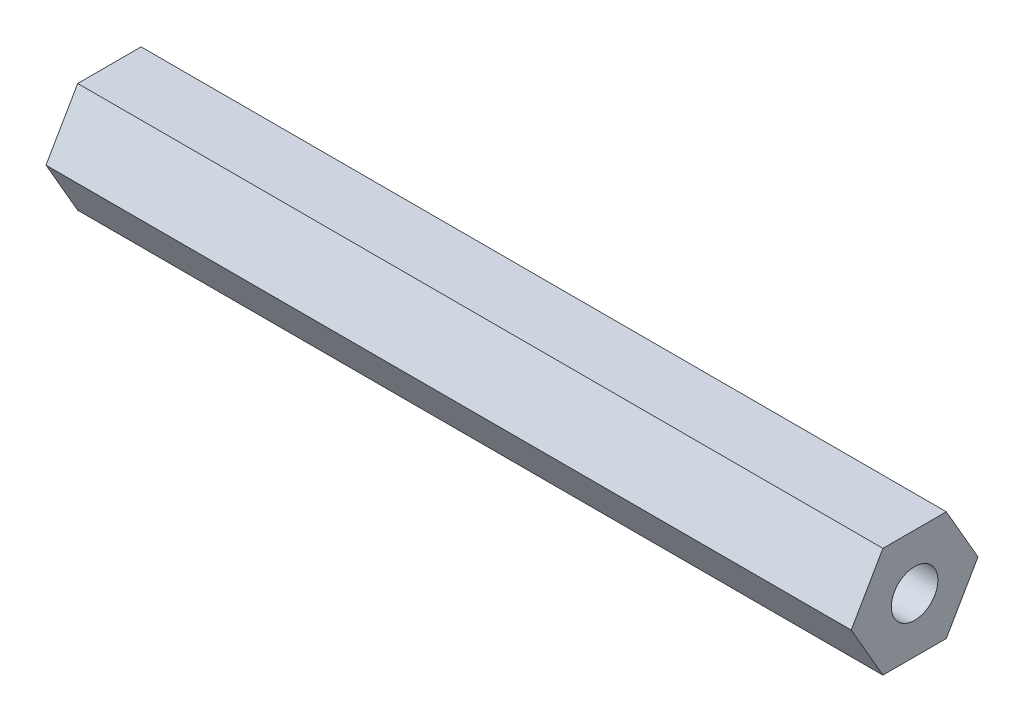
ISO-10303-21;
HEADER;
FILE_DESCRIPTION(('STEP AP214'),'2;1');
FILE_NAME('part.step','',(''),(''),'','','');
FILE_SCHEMA(('AUTOMOTIVE_DESIGN { 1 0 10303 214 1 1 1 1 }'));
ENDSEC;
DATA;
#1=APPLICATION_CONTEXT('core data for automotive mechanical design processes');
#2=APPLICATION_PROTOCOL_DEFINITION('international standard','automotive_design',2000,#1);
#3=PRODUCT_CONTEXT('',#1,'mechanical');
#4=PRODUCT('Part','Part','',(#3));
#5=PRODUCT_RELATED_PRODUCT_CATEGORY('part','',(#4));
#6=PRODUCT_DEFINITION_FORMATION('','',#4);
#7=PRODUCT_DEFINITION_CONTEXT('part definition',#1,'design');
#8=PRODUCT_DEFINITION('design','',#6,#7);
#9=PRODUCT_DEFINITION_SHAPE('','',#8);
#10=(LENGTH_UNIT() NAMED_UNIT(*) SI_UNIT(.MILLI.,.METRE.));
#11=(NAMED_UNIT(*) PLANE_ANGLE_UNIT() SI_UNIT($,.RADIAN.));
#12=(NAMED_UNIT(*) SI_UNIT($,.STERADIAN.) SOLID_ANGLE_UNIT());
#13=UNCERTAINTY_MEASURE_WITH_UNIT(LENGTH_MEASURE(1.E-05),#10,'distance_accuracy_value','');
#14=(GEOMETRIC_REPRESENTATION_CONTEXT(3) GLOBAL_UNCERTAINTY_ASSIGNED_CONTEXT((#13)) GLOBAL_UNIT_ASSIGNED_CONTEXT((#10,
#11,#12)) REPRESENTATION_CONTEXT('',''));
#15=CARTESIAN_POINT('',(0.,0.,0.));
#16=DIRECTION('',(0.,0.,1.));
#17=DIRECTION('',(1.,0.,0.));
#18=AXIS2_PLACEMENT_3D('',#15,#16,#17);
#19=CARTESIAN_POINT('',(38.1,-4.7625,2.74963065701554));
#20=DIRECTION('',(0.,1.,0.));
#21=DIRECTION('',(0.,0.,-1.));
#22=AXIS2_PLACEMENT_3D('',#19,#20,#21);
#23=PLANE('',#22);
#24=DIRECTION('',(-1.,0.,0.));
#25=VECTOR('',#24,1.);
#26=CARTESIAN_POINT('',(38.1,-4.7625,2.74963065701554));
#27=LINE('',#26,#25);
#28=CARTESIAN_POINT('',(44.45,-4.7625,2.74963065701554));
#29=VERTEX_POINT('',#28);
#30=CARTESIAN_POINT('',(-25.4,-4.76250000000003,2.74963065701553));
#31=VERTEX_POINT('',#30);
#32=EDGE_CURVE('E58',#29,#31,#27,.T.);
#33=ORIENTED_EDGE('',*,*,#32,.T.);
#34=DIRECTION('',(0.,0.,-1.));
#35=VECTOR('',#34,1.);
#36=CARTESIAN_POINT('',(-25.4,-4.7625,-5.49926131403119));
#37=LINE('',#36,#35);
#38=CARTESIAN_POINT('',(-25.4,-4.76250000000001,-2.74963065701564));
#39=VERTEX_POINT('',#38);
#40=EDGE_CURVE('E106',#31,#39,#37,.T.);
#41=ORIENTED_EDGE('',*,*,#40,.T.);
#42=DIRECTION('',(-1.,0.,0.));
#43=VECTOR('',#42,1.);
#44=CARTESIAN_POINT('',(38.1,-4.7625,-2.74963065701564));
#45=LINE('',#44,#43);
#46=CARTESIAN_POINT('',(44.45,-4.7625,-2.74963065701564));
#47=VERTEX_POINT('',#46);
#48=EDGE_CURVE('E101',#47,#39,#45,.T.);
#49=ORIENTED_EDGE('',*,*,#48,.F.);
#50=DIRECTION('',(0.,0.,-1.));
#51=VECTOR('',#50,1.);
#52=CARTESIAN_POINT('',(44.45,-4.7625,2.74963065701554));
#53=LINE('',#52,#51);
#54=EDGE_CURVE('E105',#29,#47,#53,.T.);
#55=ORIENTED_EDGE('',*,*,#54,.F.);
#56=EDGE_LOOP('',(#33,#41,#49,#55));
#57=FACE_BOUND('',#56,.T.);
#58=ADVANCED_FACE('F49',(#57),#23,.F.);
#59=CARTESIAN_POINT('',(38.1,0.,5.49926131403117));
#60=DIRECTION('',(0.,0.500000000000007,-0.866025403784435));
#61=DIRECTION('',(-1.,0.,0.));
#62=AXIS2_PLACEMENT_3D('',#59,#60,#61);
#63=PLANE('',#62);
#64=DIRECTION('',(-1.,0.,0.));
#65=VECTOR('',#64,1.);
#66=CARTESIAN_POINT('',(38.1,0.,5.49926131403117));
#67=LINE('',#66,#65);
#68=CARTESIAN_POINT('',(44.45,0.,5.49926131403117));
#69=VERTEX_POINT('',#68);
#70=CARTESIAN_POINT('',(-25.4,0.,5.49926131403117));
#71=VERTEX_POINT('',#70);
#72=EDGE_CURVE('E169',#69,#71,#67,.T.);
#73=ORIENTED_EDGE('',*,*,#72,.T.);
#74=DIRECTION('',(0.,-0.866025403784435,-0.500000000000007));
#75=VECTOR('',#74,1.);
#76=CARTESIAN_POINT('',(-25.4,0.,5.49926131403117));
#77=LINE('',#76,#75);
#78=EDGE_CURVE('E159',#71,#31,#77,.T.);
#79=ORIENTED_EDGE('',*,*,#78,.T.);
#80=ORIENTED_EDGE('',*,*,#32,.F.);
#81=DIRECTION('',(0.,-0.866025403784434,-0.500000000000008));
#82=VECTOR('',#81,1.);
#83=CARTESIAN_POINT('',(44.45,0.,5.49926131403117));
#84=LINE('',#83,#82);
#85=EDGE_CURVE('E127',#69,#29,#84,.T.);
#86=ORIENTED_EDGE('',*,*,#85,.F.);
#87=EDGE_LOOP('',(#73,#79,#80,#86));
#88=FACE_BOUND('',#87,.T.);
#89=ADVANCED_FACE('F51',(#88),#63,.F.);
#90=CARTESIAN_POINT('',(38.1,4.7625,2.7496306570156));
#91=DIRECTION('',(0.,-0.5,-0.866025403784442));
#92=DIRECTION('',(0.,-0.866025403784442,0.5));
#93=AXIS2_PLACEMENT_3D('',#90,#91,#92);
#94=PLANE('',#93);
#95=DIRECTION('',(-1.,0.,0.));
#96=VECTOR('',#95,1.);
#97=CARTESIAN_POINT('',(38.1,4.7625,2.7496306570156));
#98=LINE('',#97,#96);
#99=CARTESIAN_POINT('',(44.45,4.7625,2.7496306570156));
#100=VERTEX_POINT('',#99);
#101=CARTESIAN_POINT('',(-25.4,4.76249999999998,2.7496306570156));
#102=VERTEX_POINT('',#101);
#103=EDGE_CURVE('E165',#100,#102,#98,.T.);
#104=ORIENTED_EDGE('',*,*,#103,.T.);
#105=DIRECTION('',(0.,-0.866025403784439,0.499999999999999));
#106=VECTOR('',#105,1.);
#107=CARTESIAN_POINT('',(-25.4,4.7625,2.7496306570156));
#108=LINE('',#107,#106);
#109=EDGE_CURVE('E155',#102,#71,#108,.T.);
#110=ORIENTED_EDGE('',*,*,#109,.T.);
#111=ORIENTED_EDGE('',*,*,#72,.F.);
#112=DIRECTION('',(0.,-0.866025403784443,0.499999999999993));
#113=VECTOR('',#112,1.);
#114=CARTESIAN_POINT('',(44.45,4.7625,2.7496306570156));
#115=LINE('',#114,#113);
#116=EDGE_CURVE('E141',#100,#69,#115,.T.);
#117=ORIENTED_EDGE('',*,*,#116,.F.);
#118=EDGE_LOOP('',(#104,#110,#111,#117));
#119=FACE_BOUND('',#118,.T.);
#120=ADVANCED_FACE('F180',(#119),#94,.F.);
#121=CARTESIAN_POINT('',(38.1,4.7625,-2.74963065701557));
#122=DIRECTION('',(0.,-1.,0.));
#123=DIRECTION('',(0.,0.,-1.));
#124=AXIS2_PLACEMENT_3D('',#121,#122,#123);
#125=PLANE('',#124);
#126=DIRECTION('',(-1.,0.,0.));
#127=VECTOR('',#126,1.);
#128=CARTESIAN_POINT('',(38.1,4.7625,-2.74963065701557));
#129=LINE('',#128,#127);
#130=CARTESIAN_POINT('',(44.45,4.7625,-2.74963065701557));
#131=VERTEX_POINT('',#130);
#132=CARTESIAN_POINT('',(-25.4,4.7625,-2.74963065701558));
#133=VERTEX_POINT('',#132);
#134=EDGE_CURVE('E109',#131,#133,#129,.T.);
#135=ORIENTED_EDGE('',*,*,#134,.T.);
#136=DIRECTION('',(0.,0.,-1.));
#137=VECTOR('',#136,1.);
#138=CARTESIAN_POINT('',(-25.4,4.76250000000001,-5.49926131403115));
#139=LINE('',#138,#137);
#140=EDGE_CURVE('E146',#102,#133,#139,.T.);
#141=ORIENTED_EDGE('',*,*,#140,.F.);
#142=ORIENTED_EDGE('',*,*,#103,.F.);
#143=DIRECTION('',(0.,0.,1.));
#144=VECTOR('',#143,1.);
#145=CARTESIAN_POINT('',(44.45,4.7625,-2.74963065701557));
#146=LINE('',#145,#144);
#147=EDGE_CURVE('E137',#131,#100,#146,.T.);
#148=ORIENTED_EDGE('',*,*,#147,.F.);
#149=EDGE_LOOP('',(#135,#141,#142,#148));
#150=FACE_BOUND('',#149,.T.);
#151=ADVANCED_FACE('F183',(#150),#125,.F.);
#152=CARTESIAN_POINT('',(38.1,0.,-5.49926131403117));
#153=DIRECTION('',(0.,-0.5,0.866025403784438));
#154=DIRECTION('',(-1.,0.,0.));
#155=AXIS2_PLACEMENT_3D('',#152,#153,#154);
#156=PLANE('',#155);
#157=DIRECTION('',(-1.,0.,0.));
#158=VECTOR('',#157,1.);
#159=CARTESIAN_POINT('',(38.1,0.,-5.49926131403117));
#160=LINE('',#159,#158);
#161=CARTESIAN_POINT('',(44.45,0.,-5.49926131403117));
#162=VERTEX_POINT('',#161);
#163=CARTESIAN_POINT('',(-25.4,0.,-5.49926131403117));
#164=VERTEX_POINT('',#163);
#165=EDGE_CURVE('E110',#162,#164,#160,.T.);
#166=ORIENTED_EDGE('',*,*,#165,.T.);
#167=DIRECTION('',(0.,0.866025403784438,0.5));
#168=VECTOR('',#167,1.);
#169=CARTESIAN_POINT('',(-25.4,0.,-5.49926131403117));
#170=LINE('',#169,#168);
#171=EDGE_CURVE('E65',#164,#133,#170,.T.);
#172=ORIENTED_EDGE('',*,*,#171,.T.);
#173=ORIENTED_EDGE('',*,*,#134,.F.);
#174=DIRECTION('',(0.,0.866025403784438,0.500000000000001));
#175=VECTOR('',#174,1.);
#176=CARTESIAN_POINT('',(44.45,0.,-5.49926131403117));
#177=LINE('',#176,#175);
#178=EDGE_CURVE('E120',#162,#131,#177,.T.);
#179=ORIENTED_EDGE('',*,*,#178,.F.);
#180=EDGE_LOOP('',(#166,#172,#173,#179));
#181=FACE_BOUND('',#180,.T.);
#182=ADVANCED_FACE('F187',(#181),#156,.F.);
#183=CARTESIAN_POINT('',(38.1,-4.7625,-2.74963065701564));
#184=DIRECTION('',(0.,0.5,0.866025403784442));
#185=DIRECTION('',(1.,0.,0.));
#186=AXIS2_PLACEMENT_3D('',#183,#184,#185);
#187=PLANE('',#186);
#188=ORIENTED_EDGE('',*,*,#48,.T.);
#189=DIRECTION('',(0.,0.866025403784439,-0.499999999999999));
#190=VECTOR('',#189,1.);
#191=CARTESIAN_POINT('',(-25.4,-4.7625,-2.74963065701564));
#192=LINE('',#191,#190);
#193=EDGE_CURVE('E69',#39,#164,#192,.T.);
#194=ORIENTED_EDGE('',*,*,#193,.T.);
#195=ORIENTED_EDGE('',*,*,#165,.F.);
#196=DIRECTION('',(0.,0.866025403784444,-0.499999999999991));
#197=VECTOR('',#196,1.);
#198=CARTESIAN_POINT('',(44.45,-4.7625,-2.74963065701564));
#199=LINE('',#198,#197);
#200=EDGE_CURVE('E113',#47,#162,#199,.T.);
#201=ORIENTED_EDGE('',*,*,#200,.F.);
#202=EDGE_LOOP('',(#188,#194,#195,#201));
#203=FACE_BOUND('',#202,.T.);
#204=ADVANCED_FACE('F114',(#203),#187,.F.);
#205=CARTESIAN_POINT('',(-25.4,-4.7625,-5.49926131403119));
#206=DIRECTION('',(1.,0.,0.));
#207=DIRECTION('',(0.,0.,-1.));
#208=AXIS2_PLACEMENT_3D('',#205,#206,#207);
#209=PLANE('',#208);
#210=CARTESIAN_POINT('',(-25.4,0.,0.));
#211=DIRECTION('',(1.,0.,0.));
#212=DIRECTION('',(0.,0.,-1.));
#213=AXIS2_PLACEMENT_3D('',#210,#211,#212);
#214=CIRCLE('',#213,2.0193);
#215=CARTESIAN_POINT('',(-25.4,0.,-2.0193));
#216=VERTEX_POINT('',#215);
#217=EDGE_CURVE('E11',#216,#216,#214,.F.);
#218=ORIENTED_EDGE('',*,*,#217,.F.);
#219=EDGE_LOOP('',(#218));
#220=FACE_BOUND('',#219,.T.);
#221=ORIENTED_EDGE('',*,*,#109,.F.);
#222=ORIENTED_EDGE('',*,*,#140,.T.);
#223=ORIENTED_EDGE('',*,*,#171,.F.);
#224=ORIENTED_EDGE('',*,*,#193,.F.);
#225=ORIENTED_EDGE('',*,*,#40,.F.);
#226=ORIENTED_EDGE('',*,*,#78,.F.);
#227=EDGE_LOOP('',(#221,#222,#223,#224,#225,#226));
#228=FACE_BOUND('',#227,.T.);
#229=ADVANCED_FACE('F185',(#220,#228),#209,.F.);
#230=CARTESIAN_POINT('',(-38.1,0.,0.));
#231=DIRECTION('',(-1.,0.,0.));
#232=DIRECTION('',(0.,0.,1.));
#233=AXIS2_PLACEMENT_3D('',#230,#231,#232);
#234=CYLINDRICAL_SURFACE('',#233,2.0193);
#235=ORIENTED_EDGE('',*,*,#217,.T.);
#236=EDGE_LOOP('',(#235));
#237=FACE_BOUND('',#236,.T.);
#238=CARTESIAN_POINT('',(44.45,0.,0.));
#239=DIRECTION('',(1.,0.,0.));
#240=DIRECTION('',(0.,0.,-1.));
#241=AXIS2_PLACEMENT_3D('',#238,#239,#240);
#242=CIRCLE('',#241,2.0193);
#243=CARTESIAN_POINT('',(44.45,0.,-2.0193));
#244=VERTEX_POINT('',#243);
#245=EDGE_CURVE('E129',#244,#244,#242,.T.);
#246=ORIENTED_EDGE('',*,*,#245,.T.);
#247=EDGE_LOOP('',(#246));
#248=FACE_BOUND('',#247,.T.);
#249=ADVANCED_FACE('F204',(#237,#248),#234,.F.);
#250=CARTESIAN_POINT('',(44.45,0.,0.));
#251=DIRECTION('',(1.,0.,0.));
#252=DIRECTION('',(0.,0.,-1.));
#253=AXIS2_PLACEMENT_3D('',#250,#251,#252);
#254=PLANE('',#253);
#255=ORIENTED_EDGE('',*,*,#54,.T.);
#256=ORIENTED_EDGE('',*,*,#200,.T.);
#257=ORIENTED_EDGE('',*,*,#178,.T.);
#258=ORIENTED_EDGE('',*,*,#147,.T.);
#259=ORIENTED_EDGE('',*,*,#116,.T.);
#260=ORIENTED_EDGE('',*,*,#85,.T.);
#261=EDGE_LOOP('',(#255,#256,#257,#258,#259,#260));
#262=FACE_BOUND('',#261,.T.);
#263=ORIENTED_EDGE('',*,*,#245,.F.);
#264=EDGE_LOOP('',(#263));
#265=FACE_BOUND('',#264,.T.);
#266=ADVANCED_FACE('F123',(#262,#265),#254,.T.);
#267=CLOSED_SHELL('',(#58,#89,#120,#151,#182,#204,#229,#249,#266));
#268=MANIFOLD_SOLID_BREP('B2',#267);
#269=ADVANCED_BREP_SHAPE_REPRESENTATION('',(#18,#268),#14);
#270=SHAPE_DEFINITION_REPRESENTATION(#9,#269);
ENDSEC;
END-ISO-10303-21;
